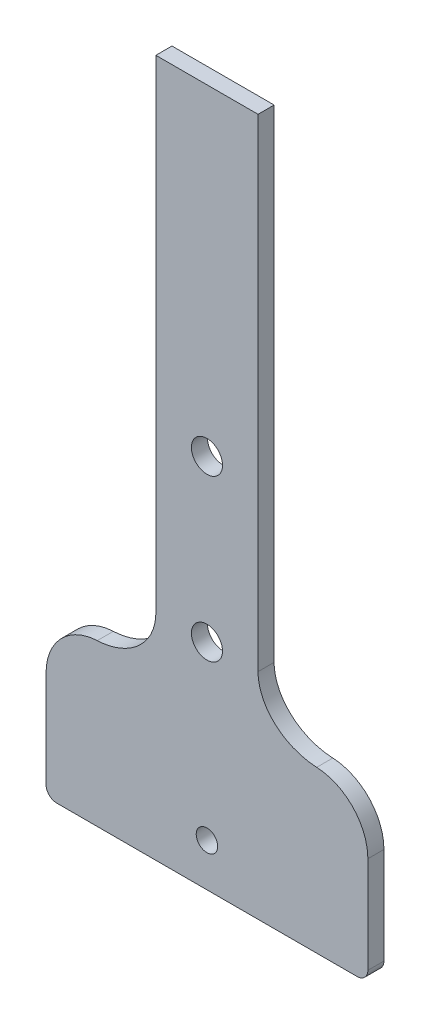
ISO-10303-21;
HEADER;
FILE_DESCRIPTION(('STEP AP214'),'2;1');
FILE_NAME('part.step','',(''),(''),'','','');
FILE_SCHEMA(('AUTOMOTIVE_DESIGN { 1 0 10303 214 1 1 1 1 }'));
ENDSEC;
DATA;
#1=APPLICATION_CONTEXT('core data for automotive mechanical design processes');
#2=APPLICATION_PROTOCOL_DEFINITION('international standard','automotive_design',2000,#1);
#3=PRODUCT_CONTEXT('',#1,'mechanical');
#4=PRODUCT('Part','Part','',(#3));
#5=PRODUCT_RELATED_PRODUCT_CATEGORY('part','',(#4));
#6=PRODUCT_DEFINITION_FORMATION('','',#4);
#7=PRODUCT_DEFINITION_CONTEXT('part definition',#1,'design');
#8=PRODUCT_DEFINITION('design','',#6,#7);
#9=PRODUCT_DEFINITION_SHAPE('','',#8);
#10=(LENGTH_UNIT() NAMED_UNIT(*) SI_UNIT(.MILLI.,.METRE.));
#11=(NAMED_UNIT(*) PLANE_ANGLE_UNIT() SI_UNIT($,.RADIAN.));
#12=(NAMED_UNIT(*) SI_UNIT($,.STERADIAN.) SOLID_ANGLE_UNIT());
#13=UNCERTAINTY_MEASURE_WITH_UNIT(LENGTH_MEASURE(1.E-05),#10,'distance_accuracy_value','');
#14=(GEOMETRIC_REPRESENTATION_CONTEXT(3) GLOBAL_UNCERTAINTY_ASSIGNED_CONTEXT((#13)) GLOBAL_UNIT_ASSIGNED_CONTEXT((#10,
#11,#12)) REPRESENTATION_CONTEXT('',''));
#15=CARTESIAN_POINT('',(0.,0.,0.));
#16=DIRECTION('',(0.,0.,1.));
#17=DIRECTION('',(1.,0.,0.));
#18=AXIS2_PLACEMENT_3D('',#15,#16,#17);
#19=CARTESIAN_POINT('',(1.,1.,1.5));
#20=DIRECTION('',(0.,0.,1.));
#21=DIRECTION('',(1.,0.,0.));
#22=AXIS2_PLACEMENT_3D('',#19,#20,#21);
#23=PLANE('',#22);
#24=CARTESIAN_POINT('',(15.,4.,1.5));
#25=DIRECTION('',(0.,0.,1.));
#26=DIRECTION('',(1.,0.,0.));
#27=AXIS2_PLACEMENT_3D('',#24,#25,#26);
#28=CIRCLE('',#27,1.);
#29=CARTESIAN_POINT('',(16.,4.,1.5));
#30=VERTEX_POINT('',#29);
#31=EDGE_CURVE('E328',#30,#30,#28,.T.);
#32=ORIENTED_EDGE('',*,*,#31,.F.);
#33=EDGE_LOOP('',(#32));
#34=FACE_BOUND('',#33,.T.);
#35=CARTESIAN_POINT('',(1.,1.,1.5));
#36=DIRECTION('',(0.,0.,1.));
#37=DIRECTION('',(1.,0.,0.));
#38=AXIS2_PLACEMENT_3D('',#35,#36,#37);
#39=CIRCLE('',#38,1.);
#40=CARTESIAN_POINT('',(0.,1.,1.5));
#41=VERTEX_POINT('',#40);
#42=CARTESIAN_POINT('',(1.,0.,1.5));
#43=VERTEX_POINT('',#42);
#44=EDGE_CURVE('E321',#41,#43,#39,.T.);
#45=ORIENTED_EDGE('',*,*,#44,.T.);
#46=DIRECTION('',(1.,0.,0.));
#47=VECTOR('',#46,1.);
#48=CARTESIAN_POINT('',(1.,0.,1.5));
#49=LINE('',#48,#47);
#50=CARTESIAN_POINT('',(29.,0.,1.5));
#51=VERTEX_POINT('',#50);
#52=EDGE_CURVE('E108',#43,#51,#49,.T.);
#53=ORIENTED_EDGE('',*,*,#52,.T.);
#54=CARTESIAN_POINT('',(29.,1.,1.5));
#55=DIRECTION('',(0.,0.,1.));
#56=DIRECTION('',(1.,0.,0.));
#57=AXIS2_PLACEMENT_3D('',#54,#55,#56);
#58=CIRCLE('',#57,1.);
#59=CARTESIAN_POINT('',(30.,1.,1.5));
#60=VERTEX_POINT('',#59);
#61=EDGE_CURVE('E225',#51,#60,#58,.T.);
#62=ORIENTED_EDGE('',*,*,#61,.T.);
#63=DIRECTION('',(0.,1.,0.));
#64=VECTOR('',#63,1.);
#65=CARTESIAN_POINT('',(30.,1.,1.5));
#66=LINE('',#65,#64);
#67=CARTESIAN_POINT('',(30.,10.0108052781688,1.5));
#68=VERTEX_POINT('',#67);
#69=EDGE_CURVE('E308',#60,#68,#66,.T.);
#70=ORIENTED_EDGE('',*,*,#69,.T.);
#71=CARTESIAN_POINT('',(25.2299896054474,15.0070576768955,1.5));
#72=CARTESIAN_POINT('',(25.5501568265481,14.9923098332208,1.5));
#73=CARTESIAN_POINT('',(25.8674136613697,14.9468759100156,1.5));
#74=CARTESIAN_POINT('',(26.4886747862802,14.7962083420721,1.5));
#75=CARTESIAN_POINT('',(26.7876262209503,14.6924484106774,1.5));
#76=CARTESIAN_POINT('',(27.3629219554328,14.4299044262166,1.5));
#77=CARTESIAN_POINT('',(27.6420242645875,14.2689345451115,1.5));
#78=CARTESIAN_POINT('',(28.1596792190013,13.9000817217873,1.5));
#79=CARTESIAN_POINT('',(28.398424750681,13.6930933628727,1.5));
#80=CARTESIAN_POINT('',(28.8360631235103,13.2343423824905,1.5));
#81=CARTESIAN_POINT('',(29.0356778101792,12.9804277574317,1.5));
#82=CARTESIAN_POINT('',(29.377858406919,12.4476017200803,1.5));
#83=CARTESIAN_POINT('',(29.5228364402657,12.1667174939612,1.5));
#84=CARTESIAN_POINT('',(29.7596675495884,11.5755076172487,1.5));
#85=CARTESIAN_POINT('',(29.8499485117463,11.2672681189809,1.5));
#86=CARTESIAN_POINT('',(29.9694853442409,10.6466168326974,1.5));
#87=CARTESIAN_POINT('',(30.,10.3313093426447,1.5));
#88=CARTESIAN_POINT('',(30.,10.0108052781688,1.5));
#89=B_SPLINE_CURVE_WITH_KNOTS('',3,(#71,#72,#73,#74,#75,#76,#77,#78,#79,#80,#81,#82,#83,#84,#85,
#86,#87,#88),.UNSPECIFIED.,.F.,.F.,(4,2,2,2,2,2,2,2,4),(0.,0.125,0.25,0.375,0.5,0.625,0.75,
0.875,1.),.UNSPECIFIED.);
#90=CARTESIAN_POINT('',(25.2299896054474,15.0070576768955,1.5));
#91=VERTEX_POINT('',#90);
#92=EDGE_CURVE('E282',#68,#91,#89,.F.);
#93=ORIENTED_EDGE('',*,*,#92,.T.);
#94=CARTESIAN_POINT('',(25.5366424127107,20.,1.5));
#95=DIRECTION('',(0.,0.,-1.));
#96=DIRECTION('',(-1.,0.,0.));
#97=AXIS2_PLACEMENT_3D('',#94,#95,#96);
#98=ELLIPSE('',#97,5.77350269189626,5.);
#99=CARTESIAN_POINT('',(19.7631397208144,20.,1.5));
#100=VERTEX_POINT('',#99);
#101=EDGE_CURVE('E268',#91,#100,#98,.T.);
#102=ORIENTED_EDGE('',*,*,#101,.T.);
#103=DIRECTION('',(0.,1.,0.));
#104=VECTOR('',#103,1.);
#105=CARTESIAN_POINT('',(19.7631397208144,20.,1.5));
#106=LINE('',#105,#104);
#107=CARTESIAN_POINT('',(19.7631397208144,65.,1.5));
#108=VERTEX_POINT('',#107);
#109=EDGE_CURVE('E255',#100,#108,#106,.T.);
#110=ORIENTED_EDGE('',*,*,#109,.T.);
#111=DIRECTION('',(-1.,0.,0.));
#112=VECTOR('',#111,1.);
#113=CARTESIAN_POINT('',(19.7631397208144,65.,1.5));
#114=LINE('',#113,#112);
#115=CARTESIAN_POINT('',(10.2368602791856,65.,1.5));
#116=VERTEX_POINT('',#115);
#117=EDGE_CURVE('E264',#108,#116,#114,.T.);
#118=ORIENTED_EDGE('',*,*,#117,.T.);
#119=DIRECTION('',(0.,-1.,0.));
#120=VECTOR('',#119,1.);
#121=CARTESIAN_POINT('',(10.2368602791856,65.,1.5));
#122=LINE('',#121,#120);
#123=CARTESIAN_POINT('',(10.2368602791856,20.,1.5));
#124=VERTEX_POINT('',#123);
#125=EDGE_CURVE('E140',#116,#124,#122,.T.);
#126=ORIENTED_EDGE('',*,*,#125,.T.);
#127=CARTESIAN_POINT('',(4.46335758728933,20.,1.5));
#128=DIRECTION('',(0.,0.,-1.));
#129=DIRECTION('',(1.,0.,0.));
#130=AXIS2_PLACEMENT_3D('',#127,#128,#129);
#131=ELLIPSE('',#130,5.77350269189626,5.);
#132=CARTESIAN_POINT('',(4.77001039455257,15.0070576768955,1.5));
#133=VERTEX_POINT('',#132);
#134=EDGE_CURVE('E133',#124,#133,#131,.T.);
#135=ORIENTED_EDGE('',*,*,#134,.T.);
#136=CARTESIAN_POINT('',(0.,10.0108052781688,1.5));
#137=CARTESIAN_POINT('',(0.,10.3313070070156,1.5));
#138=CARTESIAN_POINT('',(0.0307509602836312,10.6502705555694,1.5));
#139=CARTESIAN_POINT('',(0.152573660064995,11.2778809843903,1.5));
#140=CARTESIAN_POINT('',(0.242397802366398,11.581322907929,1.5));
#141=CARTESIAN_POINT('',(0.478004618785788,12.1681493861524,1.5));
#142=CARTESIAN_POINT('',(0.625834171278446,12.4543857043808,1.5));
#143=CARTESIAN_POINT('',(0.970282061510011,12.988644640569,1.5));
#144=CARTESIAN_POINT('',(1.16596164994364,13.2367506133586,1.5));
#145=CARTESIAN_POINT('',(1.60386948990164,13.6952096709976,1.5));
#146=CARTESIAN_POINT('',(1.84823792866089,13.9064080334147,1.5));
#147=CARTESIAN_POINT('',(2.36462212455254,14.2729658119091,1.5));
#148=CARTESIAN_POINT('',(2.63847844745342,14.430814604172,1.5));
#149=CARTESIAN_POINT('',(3.21806270084157,14.6947702050187,1.5));
#150=CARTESIAN_POINT('',(3.52181244234221,14.7992208505749,1.5));
#151=CARTESIAN_POINT('',(4.13628201345512,14.9472920664723,1.5));
#152=CARTESIAN_POINT('',(4.44984535708774,14.9923099338054,1.5));
#153=CARTESIAN_POINT('',(4.77001039455257,15.0070576768955,1.5));
#154=B_SPLINE_CURVE_WITH_KNOTS('',3,(#136,#137,#138,#139,#140,#141,#142,#143,#144,#145,#146,
#147,#148,#149,#150,#151,#152,#153),.UNSPECIFIED.,.F.,.F.,(4,2,2,2,2,2,2,2,4),(0.,0.125,0.25,
0.375,0.5,0.625,0.75,0.875,1.),.UNSPECIFIED.);
#155=CARTESIAN_POINT('',(0.,10.0108052781688,1.5));
#156=VERTEX_POINT('',#155);
#157=EDGE_CURVE('E137',#133,#156,#154,.F.);
#158=ORIENTED_EDGE('',*,*,#157,.T.);
#159=DIRECTION('',(0.,-1.,0.));
#160=VECTOR('',#159,1.);
#161=CARTESIAN_POINT('',(0.,10.0108052781688,1.5));
#162=LINE('',#161,#160);
#163=EDGE_CURVE('E52',#156,#41,#162,.T.);
#164=ORIENTED_EDGE('',*,*,#163,.T.);
#165=EDGE_LOOP('',(#45,#53,#62,#70,#93,#102,#110,#118,#126,#135,#158,#164));
#166=FACE_BOUND('',#165,.T.);
#167=CARTESIAN_POINT('',(15.,20.,1.5));
#168=DIRECTION('',(0.,0.,1.));
#169=DIRECTION('',(1.,0.,0.));
#170=AXIS2_PLACEMENT_3D('',#167,#168,#169);
#171=CIRCLE('',#170,1.45);
#172=CARTESIAN_POINT('',(16.45,20.,1.5));
#173=VERTEX_POINT('',#172);
#174=EDGE_CURVE('E190',#173,#173,#171,.T.);
#175=ORIENTED_EDGE('',*,*,#174,.F.);
#176=EDGE_LOOP('',(#175));
#177=FACE_BOUND('',#176,.T.);
#178=CARTESIAN_POINT('',(15.,35.,1.5));
#179=DIRECTION('',(0.,0.,1.));
#180=DIRECTION('',(1.,0.,0.));
#181=AXIS2_PLACEMENT_3D('',#178,#179,#180);
#182=CIRCLE('',#181,1.45);
#183=CARTESIAN_POINT('',(16.45,35.,1.5));
#184=VERTEX_POINT('',#183);
#185=EDGE_CURVE('E334',#184,#184,#182,.T.);
#186=ORIENTED_EDGE('',*,*,#185,.F.);
#187=EDGE_LOOP('',(#186));
#188=FACE_BOUND('',#187,.T.);
#189=ADVANCED_FACE('F33',(#34,#166,#177,#188),#23,.T.);
#190=CARTESIAN_POINT('',(1.,1.,0.));
#191=DIRECTION('',(0.,0.,1.));
#192=DIRECTION('',(1.,0.,0.));
#193=AXIS2_PLACEMENT_3D('',#190,#191,#192);
#194=PLANE('',#193);
#195=CARTESIAN_POINT('',(15.,4.,0.));
#196=DIRECTION('',(0.,0.,1.));
#197=DIRECTION('',(1.,0.,0.));
#198=AXIS2_PLACEMENT_3D('',#195,#196,#197);
#199=CIRCLE('',#198,1.);
#200=CARTESIAN_POINT('',(16.,4.,0.));
#201=VERTEX_POINT('',#200);
#202=EDGE_CURVE('E331',#201,#201,#199,.T.);
#203=ORIENTED_EDGE('',*,*,#202,.T.);
#204=EDGE_LOOP('',(#203));
#205=FACE_BOUND('',#204,.T.);
#206=CARTESIAN_POINT('',(1.,1.,0.));
#207=DIRECTION('',(0.,0.,1.));
#208=DIRECTION('',(1.,0.,0.));
#209=AXIS2_PLACEMENT_3D('',#206,#207,#208);
#210=CIRCLE('',#209,1.);
#211=CARTESIAN_POINT('',(0.,1.,0.));
#212=VERTEX_POINT('',#211);
#213=CARTESIAN_POINT('',(1.,0.,0.));
#214=VERTEX_POINT('',#213);
#215=EDGE_CURVE('E183',#212,#214,#210,.T.);
#216=ORIENTED_EDGE('',*,*,#215,.F.);
#217=DIRECTION('',(0.,-1.,0.));
#218=VECTOR('',#217,1.);
#219=CARTESIAN_POINT('',(0.,10.0108052781688,0.));
#220=LINE('',#219,#218);
#221=CARTESIAN_POINT('',(0.,10.0108052781688,0.));
#222=VERTEX_POINT('',#221);
#223=EDGE_CURVE('E100',#222,#212,#220,.T.);
#224=ORIENTED_EDGE('',*,*,#223,.F.);
#225=CARTESIAN_POINT('',(4.77001039455257,15.0070576768955,0.));
#226=CARTESIAN_POINT('',(4.44984535708774,14.9923099338054,0.));
#227=CARTESIAN_POINT('',(4.13628201345512,14.9472920664723,0.));
#228=CARTESIAN_POINT('',(3.52181244234221,14.7992208505749,0.));
#229=CARTESIAN_POINT('',(3.21806270084157,14.6947702050187,0.));
#230=CARTESIAN_POINT('',(2.63847844745342,14.430814604172,0.));
#231=CARTESIAN_POINT('',(2.36462212455254,14.2729658119091,0.));
#232=CARTESIAN_POINT('',(1.84823792866089,13.9064080334147,0.));
#233=CARTESIAN_POINT('',(1.60386948990164,13.6952096709976,0.));
#234=CARTESIAN_POINT('',(1.16596164994364,13.2367506133586,0.));
#235=CARTESIAN_POINT('',(0.970282061510011,12.988644640569,0.));
#236=CARTESIAN_POINT('',(0.625834171278446,12.4543857043808,0.));
#237=CARTESIAN_POINT('',(0.478004618785788,12.1681493861524,0.));
#238=CARTESIAN_POINT('',(0.242397802366398,11.581322907929,0.));
#239=CARTESIAN_POINT('',(0.152573660064995,11.2778809843903,0.));
#240=CARTESIAN_POINT('',(0.0307509602836312,10.6502705555694,0.));
#241=CARTESIAN_POINT('',(0.,10.3313070070156,0.));
#242=CARTESIAN_POINT('',(0.,10.0108052781688,0.));
#243=B_SPLINE_CURVE_WITH_KNOTS('',3,(#225,#226,#227,#228,#229,#230,#231,#232,#233,#234,#235,
#236,#237,#238,#239,#240,#241,#242),.UNSPECIFIED.,.F.,.F.,(4,2,2,2,2,2,2,2,4),(0.,0.125,0.25,
0.375,0.5,0.625,0.75,0.875,1.),.UNSPECIFIED.);
#244=CARTESIAN_POINT('',(4.77001039455257,15.0070576768955,0.));
#245=VERTEX_POINT('',#244);
#246=EDGE_CURVE('E93',#245,#222,#243,.T.);
#247=ORIENTED_EDGE('',*,*,#246,.F.);
#248=CARTESIAN_POINT('',(4.46335758728933,20.,0.));
#249=DIRECTION('',(0.,0.,-1.));
#250=DIRECTION('',(1.,0.,0.));
#251=AXIS2_PLACEMENT_3D('',#248,#249,#250);
#252=ELLIPSE('',#251,5.77350269189626,5.);
#253=CARTESIAN_POINT('',(10.2368602791856,20.,0.));
#254=VERTEX_POINT('',#253);
#255=EDGE_CURVE('E148',#254,#245,#252,.T.);
#256=ORIENTED_EDGE('',*,*,#255,.F.);
#257=DIRECTION('',(0.,-1.,0.));
#258=VECTOR('',#257,1.);
#259=CARTESIAN_POINT('',(10.2368602791856,65.,0.));
#260=LINE('',#259,#258);
#261=CARTESIAN_POINT('',(10.2368602791856,65.,0.));
#262=VERTEX_POINT('',#261);
#263=EDGE_CURVE('E200',#262,#254,#260,.T.);
#264=ORIENTED_EDGE('',*,*,#263,.F.);
#265=DIRECTION('',(-1.,0.,0.));
#266=VECTOR('',#265,1.);
#267=CARTESIAN_POINT('',(19.7631397208144,65.,0.));
#268=LINE('',#267,#266);
#269=CARTESIAN_POINT('',(19.7631397208144,65.,0.));
#270=VERTEX_POINT('',#269);
#271=EDGE_CURVE('E197',#270,#262,#268,.T.);
#272=ORIENTED_EDGE('',*,*,#271,.F.);
#273=DIRECTION('',(0.,1.,0.));
#274=VECTOR('',#273,1.);
#275=CARTESIAN_POINT('',(19.7631397208144,20.,0.));
#276=LINE('',#275,#274);
#277=CARTESIAN_POINT('',(19.7631397208144,20.,0.));
#278=VERTEX_POINT('',#277);
#279=EDGE_CURVE('E195',#278,#270,#276,.T.);
#280=ORIENTED_EDGE('',*,*,#279,.F.);
#281=CARTESIAN_POINT('',(25.5366424127107,20.,0.));
#282=DIRECTION('',(0.,0.,-1.));
#283=DIRECTION('',(-1.,0.,0.));
#284=AXIS2_PLACEMENT_3D('',#281,#282,#283);
#285=ELLIPSE('',#284,5.77350269189626,5.);
#286=CARTESIAN_POINT('',(25.2299896054474,15.0070576768955,0.));
#287=VERTEX_POINT('',#286);
#288=EDGE_CURVE('E198',#287,#278,#285,.T.);
#289=ORIENTED_EDGE('',*,*,#288,.F.);
#290=CARTESIAN_POINT('',(30.,10.0108052781688,0.));
#291=CARTESIAN_POINT('',(30.,10.3313093426447,0.));
#292=CARTESIAN_POINT('',(29.9694853442409,10.6466168326974,0.));
#293=CARTESIAN_POINT('',(29.8499485117463,11.2672681189809,0.));
#294=CARTESIAN_POINT('',(29.7596675495884,11.5755076172487,0.));
#295=CARTESIAN_POINT('',(29.5228364402657,12.1667174939612,0.));
#296=CARTESIAN_POINT('',(29.377858406919,12.4476017200803,0.));
#297=CARTESIAN_POINT('',(29.0356778101792,12.9804277574317,0.));
#298=CARTESIAN_POINT('',(28.8360631235103,13.2343423824905,0.));
#299=CARTESIAN_POINT('',(28.398424750681,13.6930933628727,0.));
#300=CARTESIAN_POINT('',(28.1596792190013,13.9000817217873,0.));
#301=CARTESIAN_POINT('',(27.6420242645875,14.2689345451115,0.));
#302=CARTESIAN_POINT('',(27.3629219554328,14.4299044262166,0.));
#303=CARTESIAN_POINT('',(26.7876262209503,14.6924484106774,0.));
#304=CARTESIAN_POINT('',(26.4886747862802,14.7962083420721,0.));
#305=CARTESIAN_POINT('',(25.8674136613697,14.9468759100156,0.));
#306=CARTESIAN_POINT('',(25.5501568265481,14.9923098332208,0.));
#307=CARTESIAN_POINT('',(25.2299896054474,15.0070576768955,0.));
#308=B_SPLINE_CURVE_WITH_KNOTS('',3,(#290,#291,#292,#293,#294,#295,#296,#297,#298,#299,#300,
#301,#302,#303,#304,#305,#306,#307),.UNSPECIFIED.,.F.,.F.,(4,2,2,2,2,2,2,2,4),(0.,0.125,0.25,
0.375,0.5,0.625,0.75,0.875,1.),.UNSPECIFIED.);
#309=CARTESIAN_POINT('',(30.,10.0108052781688,0.));
#310=VERTEX_POINT('',#309);
#311=EDGE_CURVE('E233',#310,#287,#308,.T.);
#312=ORIENTED_EDGE('',*,*,#311,.F.);
#313=DIRECTION('',(0.,1.,0.));
#314=VECTOR('',#313,1.);
#315=CARTESIAN_POINT('',(30.,1.,0.));
#316=LINE('',#315,#314);
#317=CARTESIAN_POINT('',(30.,1.,0.));
#318=VERTEX_POINT('',#317);
#319=EDGE_CURVE('E194',#318,#310,#316,.T.);
#320=ORIENTED_EDGE('',*,*,#319,.F.);
#321=CARTESIAN_POINT('',(29.,1.,0.));
#322=DIRECTION('',(0.,0.,1.));
#323=DIRECTION('',(1.,0.,0.));
#324=AXIS2_PLACEMENT_3D('',#321,#322,#323);
#325=CIRCLE('',#324,1.);
#326=CARTESIAN_POINT('',(29.,0.,0.));
#327=VERTEX_POINT('',#326);
#328=EDGE_CURVE('E192',#327,#318,#325,.T.);
#329=ORIENTED_EDGE('',*,*,#328,.F.);
#330=DIRECTION('',(1.,0.,0.));
#331=VECTOR('',#330,1.);
#332=CARTESIAN_POINT('',(1.,0.,0.));
#333=LINE('',#332,#331);
#334=EDGE_CURVE('E189',#214,#327,#333,.T.);
#335=ORIENTED_EDGE('',*,*,#334,.F.);
#336=EDGE_LOOP('',(#216,#224,#247,#256,#264,#272,#280,#289,#312,#320,#329,#335));
#337=FACE_BOUND('',#336,.T.);
#338=CARTESIAN_POINT('',(15.,20.,0.));
#339=DIRECTION('',(0.,0.,1.));
#340=DIRECTION('',(1.,0.,0.));
#341=AXIS2_PLACEMENT_3D('',#338,#339,#340);
#342=CIRCLE('',#341,1.45);
#343=CARTESIAN_POINT('',(16.45,20.,0.));
#344=VERTEX_POINT('',#343);
#345=EDGE_CURVE('E325',#344,#344,#342,.T.);
#346=ORIENTED_EDGE('',*,*,#345,.T.);
#347=EDGE_LOOP('',(#346));
#348=FACE_BOUND('',#347,.T.);
#349=CARTESIAN_POINT('',(15.,35.,0.));
#350=DIRECTION('',(0.,0.,1.));
#351=DIRECTION('',(1.,0.,0.));
#352=AXIS2_PLACEMENT_3D('',#349,#350,#351);
#353=CIRCLE('',#352,1.45);
#354=CARTESIAN_POINT('',(16.45,35.,0.));
#355=VERTEX_POINT('',#354);
#356=EDGE_CURVE('E337',#355,#355,#353,.T.);
#357=ORIENTED_EDGE('',*,*,#356,.T.);
#358=EDGE_LOOP('',(#357));
#359=FACE_BOUND('',#358,.T.);
#360=ADVANCED_FACE('F229',(#205,#337,#348,#359),#194,.F.);
#361=CARTESIAN_POINT('',(1.,1.,1.5));
#362=DIRECTION('',(0.,0.,-1.));
#363=DIRECTION('',(-1.,0.,0.));
#364=AXIS2_PLACEMENT_3D('',#361,#362,#363);
#365=CYLINDRICAL_SURFACE('',#364,1.);
#366=ORIENTED_EDGE('',*,*,#215,.T.);
#367=DIRECTION('',(0.,0.,-1.));
#368=VECTOR('',#367,1.);
#369=CARTESIAN_POINT('',(1.,0.,1.5));
#370=LINE('',#369,#368);
#371=EDGE_CURVE('E11',#43,#214,#370,.T.);
#372=ORIENTED_EDGE('',*,*,#371,.F.);
#373=ORIENTED_EDGE('',*,*,#44,.F.);
#374=DIRECTION('',(0.,0.,-1.));
#375=VECTOR('',#374,1.);
#376=CARTESIAN_POINT('',(0.,1.,1.5));
#377=LINE('',#376,#375);
#378=EDGE_CURVE('E202',#41,#212,#377,.T.);
#379=ORIENTED_EDGE('',*,*,#378,.T.);
#380=EDGE_LOOP('',(#366,#372,#373,#379));
#381=FACE_BOUND('',#380,.T.);
#382=ADVANCED_FACE('F35',(#381),#365,.T.);
#383=CARTESIAN_POINT('',(1.,0.,1.5));
#384=DIRECTION('',(0.,1.,0.));
#385=DIRECTION('',(0.,0.,1.));
#386=AXIS2_PLACEMENT_3D('',#383,#384,#385);
#387=PLANE('',#386);
#388=ORIENTED_EDGE('',*,*,#334,.T.);
#389=DIRECTION('',(0.,0.,-1.));
#390=VECTOR('',#389,1.);
#391=CARTESIAN_POINT('',(29.,0.,1.5));
#392=LINE('',#391,#390);
#393=EDGE_CURVE('E43',#51,#327,#392,.T.);
#394=ORIENTED_EDGE('',*,*,#393,.F.);
#395=ORIENTED_EDGE('',*,*,#52,.F.);
#396=ORIENTED_EDGE('',*,*,#371,.T.);
#397=EDGE_LOOP('',(#388,#394,#395,#396));
#398=FACE_BOUND('',#397,.T.);
#399=ADVANCED_FACE('F400',(#398),#387,.F.);
#400=CARTESIAN_POINT('',(29.,1.,1.5));
#401=DIRECTION('',(0.,0.,-1.));
#402=DIRECTION('',(-1.,0.,0.));
#403=AXIS2_PLACEMENT_3D('',#400,#401,#402);
#404=CYLINDRICAL_SURFACE('',#403,1.);
#405=ORIENTED_EDGE('',*,*,#328,.T.);
#406=DIRECTION('',(0.,0.,-1.));
#407=VECTOR('',#406,1.);
#408=CARTESIAN_POINT('',(30.,1.,1.5));
#409=LINE('',#408,#407);
#410=EDGE_CURVE('E215',#60,#318,#409,.T.);
#411=ORIENTED_EDGE('',*,*,#410,.F.);
#412=ORIENTED_EDGE('',*,*,#61,.F.);
#413=ORIENTED_EDGE('',*,*,#393,.T.);
#414=EDGE_LOOP('',(#405,#411,#412,#413));
#415=FACE_BOUND('',#414,.T.);
#416=ADVANCED_FACE('F223',(#415),#404,.T.);
#417=CARTESIAN_POINT('',(30.,1.,1.5));
#418=DIRECTION('',(-1.,0.,0.));
#419=DIRECTION('',(0.,0.,1.));
#420=AXIS2_PLACEMENT_3D('',#417,#418,#419);
#421=PLANE('',#420);
#422=ORIENTED_EDGE('',*,*,#319,.T.);
#423=DIRECTION('',(0.,0.,-1.));
#424=VECTOR('',#423,1.);
#425=CARTESIAN_POINT('',(30.,10.0108052781688,1.5));
#426=LINE('',#425,#424);
#427=EDGE_CURVE('E218',#68,#310,#426,.T.);
#428=ORIENTED_EDGE('',*,*,#427,.F.);
#429=ORIENTED_EDGE('',*,*,#69,.F.);
#430=ORIENTED_EDGE('',*,*,#410,.T.);
#431=EDGE_LOOP('',(#422,#428,#429,#430));
#432=FACE_BOUND('',#431,.T.);
#433=ADVANCED_FACE('F298',(#432),#421,.F.);
#434=CARTESIAN_POINT('',(30.,10.0108052781688,1.5));
#435=CARTESIAN_POINT('',(30.,10.3313093426447,1.5));
#436=CARTESIAN_POINT('',(29.9694853442409,10.6466168326974,1.5));
#437=CARTESIAN_POINT('',(29.8499485117463,11.2672681189809,1.5));
#438=CARTESIAN_POINT('',(29.7596675495884,11.5755076172487,1.5));
#439=CARTESIAN_POINT('',(29.5228364402657,12.1667174939612,1.5));
#440=CARTESIAN_POINT('',(29.377858406919,12.4476017200803,1.5));
#441=CARTESIAN_POINT('',(29.0356778101792,12.9804277574317,1.5));
#442=CARTESIAN_POINT('',(28.8360631235103,13.2343423824905,1.5));
#443=CARTESIAN_POINT('',(28.398424750681,13.6930933628727,1.5));
#444=CARTESIAN_POINT('',(28.1596792190013,13.9000817217873,1.5));
#445=CARTESIAN_POINT('',(27.6420242645875,14.2689345451115,1.5));
#446=CARTESIAN_POINT('',(27.3629219554328,14.4299044262166,1.5));
#447=CARTESIAN_POINT('',(26.7876262209503,14.6924484106774,1.5));
#448=CARTESIAN_POINT('',(26.4886747862802,14.7962083420721,1.5));
#449=CARTESIAN_POINT('',(25.8674136613697,14.9468759100156,1.5));
#450=CARTESIAN_POINT('',(25.5501568265481,14.9923098332208,1.5));
#451=CARTESIAN_POINT('',(25.2299896054474,15.0070576768955,1.5));
#452=B_SPLINE_CURVE_WITH_KNOTS('',3,(#434,#435,#436,#437,#438,#439,#440,#441,#442,#443,#444,
#445,#446,#447,#448,#449,#450,#451),.UNSPECIFIED.,.F.,.F.,(4,2,2,2,2,2,2,2,4),(0.,0.125,0.25,
0.375,0.5,0.625,0.75,0.875,1.),.UNSPECIFIED.);
#453=DIRECTION('',(0.,0.,-1.));
#454=VECTOR('',#453,1.);
#455=SURFACE_OF_LINEAR_EXTRUSION('',#452,#454);
#456=ORIENTED_EDGE('',*,*,#311,.T.);
#457=DIRECTION('',(0.,0.,-1.));
#458=VECTOR('',#457,1.);
#459=CARTESIAN_POINT('',(25.2299896054474,15.0070576768955,1.5));
#460=LINE('',#459,#458);
#461=EDGE_CURVE('E214',#91,#287,#460,.T.);
#462=ORIENTED_EDGE('',*,*,#461,.F.);
#463=ORIENTED_EDGE('',*,*,#92,.F.);
#464=ORIENTED_EDGE('',*,*,#427,.T.);
#465=EDGE_LOOP('',(#456,#462,#463,#464));
#466=FACE_BOUND('',#465,.T.);
#467=ADVANCED_FACE('F289',(#466),#455,.F.);
#468=DIRECTION('',(0.,0.,-1.));
#469=VECTOR('',#468,1.);
#470=SURFACE_OF_LINEAR_EXTRUSION('',#98,#469);
#471=ORIENTED_EDGE('',*,*,#288,.T.);
#472=DIRECTION('',(0.,0.,-1.));
#473=VECTOR('',#472,1.);
#474=CARTESIAN_POINT('',(19.7631397208144,20.,1.5));
#475=LINE('',#474,#473);
#476=EDGE_CURVE('E211',#100,#278,#475,.T.);
#477=ORIENTED_EDGE('',*,*,#476,.F.);
#478=ORIENTED_EDGE('',*,*,#101,.F.);
#479=ORIENTED_EDGE('',*,*,#461,.T.);
#480=EDGE_LOOP('',(#471,#477,#478,#479));
#481=FACE_BOUND('',#480,.T.);
#482=ADVANCED_FACE('F247',(#481),#470,.F.);
#483=CARTESIAN_POINT('',(19.7631397208144,20.,1.5));
#484=DIRECTION('',(-1.,0.,0.));
#485=DIRECTION('',(0.,0.,1.));
#486=AXIS2_PLACEMENT_3D('',#483,#484,#485);
#487=PLANE('',#486);
#488=ORIENTED_EDGE('',*,*,#279,.T.);
#489=DIRECTION('',(0.,0.,-1.));
#490=VECTOR('',#489,1.);
#491=CARTESIAN_POINT('',(19.7631397208144,65.,1.5));
#492=LINE('',#491,#490);
#493=EDGE_CURVE('E208',#108,#270,#492,.T.);
#494=ORIENTED_EDGE('',*,*,#493,.F.);
#495=ORIENTED_EDGE('',*,*,#109,.F.);
#496=ORIENTED_EDGE('',*,*,#476,.T.);
#497=EDGE_LOOP('',(#488,#494,#495,#496));
#498=FACE_BOUND('',#497,.T.);
#499=ADVANCED_FACE('F253',(#498),#487,.F.);
#500=CARTESIAN_POINT('',(19.7631397208144,65.,1.5));
#501=DIRECTION('',(0.,-1.,0.));
#502=DIRECTION('',(0.,0.,-1.));
#503=AXIS2_PLACEMENT_3D('',#500,#501,#502);
#504=PLANE('',#503);
#505=ORIENTED_EDGE('',*,*,#271,.T.);
#506=DIRECTION('',(0.,0.,-1.));
#507=VECTOR('',#506,1.);
#508=CARTESIAN_POINT('',(10.2368602791856,65.,1.5));
#509=LINE('',#508,#507);
#510=EDGE_CURVE('E205',#116,#262,#509,.T.);
#511=ORIENTED_EDGE('',*,*,#510,.F.);
#512=ORIENTED_EDGE('',*,*,#117,.F.);
#513=ORIENTED_EDGE('',*,*,#493,.T.);
#514=EDGE_LOOP('',(#505,#511,#512,#513));
#515=FACE_BOUND('',#514,.T.);
#516=ADVANCED_FACE('F260',(#515),#504,.F.);
#517=CARTESIAN_POINT('',(10.2368602791856,65.,1.5));
#518=DIRECTION('',(1.,0.,0.));
#519=DIRECTION('',(0.,0.,-1.));
#520=AXIS2_PLACEMENT_3D('',#517,#518,#519);
#521=PLANE('',#520);
#522=ORIENTED_EDGE('',*,*,#263,.T.);
#523=DIRECTION('',(0.,0.,-1.));
#524=VECTOR('',#523,1.);
#525=CARTESIAN_POINT('',(10.2368602791856,20.,1.5));
#526=LINE('',#525,#524);
#527=EDGE_CURVE('E149',#124,#254,#526,.T.);
#528=ORIENTED_EDGE('',*,*,#527,.F.);
#529=ORIENTED_EDGE('',*,*,#125,.F.);
#530=ORIENTED_EDGE('',*,*,#510,.T.);
#531=EDGE_LOOP('',(#522,#528,#529,#530));
#532=FACE_BOUND('',#531,.T.);
#533=ADVANCED_FACE('F263',(#532),#521,.F.);
#534=DIRECTION('',(0.,0.,-1.));
#535=VECTOR('',#534,1.);
#536=SURFACE_OF_LINEAR_EXTRUSION('',#131,#535);
#537=ORIENTED_EDGE('',*,*,#255,.T.);
#538=DIRECTION('',(0.,0.,-1.));
#539=VECTOR('',#538,1.);
#540=CARTESIAN_POINT('',(4.77001039455257,15.0070576768955,1.5));
#541=LINE('',#540,#539);
#542=EDGE_CURVE('E145',#133,#245,#541,.T.);
#543=ORIENTED_EDGE('',*,*,#542,.F.);
#544=ORIENTED_EDGE('',*,*,#134,.F.);
#545=ORIENTED_EDGE('',*,*,#527,.T.);
#546=EDGE_LOOP('',(#537,#543,#544,#545));
#547=FACE_BOUND('',#546,.T.);
#548=ADVANCED_FACE('F146',(#547),#536,.F.);
#549=CARTESIAN_POINT('',(4.77001039455257,15.0070576768955,1.5));
#550=CARTESIAN_POINT('',(4.44984535708774,14.9923099338054,1.5));
#551=CARTESIAN_POINT('',(4.13628201345512,14.9472920664723,1.5));
#552=CARTESIAN_POINT('',(3.52181244234221,14.7992208505749,1.5));
#553=CARTESIAN_POINT('',(3.21806270084157,14.6947702050187,1.5));
#554=CARTESIAN_POINT('',(2.63847844745342,14.430814604172,1.5));
#555=CARTESIAN_POINT('',(2.36462212455254,14.2729658119091,1.5));
#556=CARTESIAN_POINT('',(1.84823792866089,13.9064080334147,1.5));
#557=CARTESIAN_POINT('',(1.60386948990164,13.6952096709976,1.5));
#558=CARTESIAN_POINT('',(1.16596164994364,13.2367506133586,1.5));
#559=CARTESIAN_POINT('',(0.970282061510011,12.988644640569,1.5));
#560=CARTESIAN_POINT('',(0.625834171278446,12.4543857043808,1.5));
#561=CARTESIAN_POINT('',(0.478004618785788,12.1681493861524,1.5));
#562=CARTESIAN_POINT('',(0.242397802366398,11.581322907929,1.5));
#563=CARTESIAN_POINT('',(0.152573660064995,11.2778809843903,1.5));
#564=CARTESIAN_POINT('',(0.0307509602836312,10.6502705555694,1.5));
#565=CARTESIAN_POINT('',(0.,10.3313070070156,1.5));
#566=CARTESIAN_POINT('',(0.,10.0108052781688,1.5));
#567=B_SPLINE_CURVE_WITH_KNOTS('',3,(#549,#550,#551,#552,#553,#554,#555,#556,#557,#558,#559,
#560,#561,#562,#563,#564,#565,#566),.UNSPECIFIED.,.F.,.F.,(4,2,2,2,2,2,2,2,4),(0.,0.125,0.25,
0.375,0.5,0.625,0.75,0.875,1.),.UNSPECIFIED.);
#568=DIRECTION('',(0.,0.,-1.));
#569=VECTOR('',#568,1.);
#570=SURFACE_OF_LINEAR_EXTRUSION('',#567,#569);
#571=ORIENTED_EDGE('',*,*,#246,.T.);
#572=DIRECTION('',(0.,0.,-1.));
#573=VECTOR('',#572,1.);
#574=CARTESIAN_POINT('',(0.,10.0108052781688,1.5));
#575=LINE('',#574,#573);
#576=EDGE_CURVE('E150',#156,#222,#575,.T.);
#577=ORIENTED_EDGE('',*,*,#576,.F.);
#578=ORIENTED_EDGE('',*,*,#157,.F.);
#579=ORIENTED_EDGE('',*,*,#542,.T.);
#580=EDGE_LOOP('',(#571,#577,#578,#579));
#581=FACE_BOUND('',#580,.T.);
#582=ADVANCED_FACE('F153',(#581),#570,.F.);
#583=CARTESIAN_POINT('',(0.,10.0108052781688,1.5));
#584=DIRECTION('',(1.,0.,0.));
#585=DIRECTION('',(0.,0.,-1.));
#586=AXIS2_PLACEMENT_3D('',#583,#584,#585);
#587=PLANE('',#586);
#588=ORIENTED_EDGE('',*,*,#223,.T.);
#589=ORIENTED_EDGE('',*,*,#378,.F.);
#590=ORIENTED_EDGE('',*,*,#163,.F.);
#591=ORIENTED_EDGE('',*,*,#576,.T.);
#592=EDGE_LOOP('',(#588,#589,#590,#591));
#593=FACE_BOUND('',#592,.T.);
#594=ADVANCED_FACE('F173',(#593),#587,.F.);
#595=CARTESIAN_POINT('',(15.,20.,1.5));
#596=DIRECTION('',(0.,0.,-1.));
#597=DIRECTION('',(-1.,0.,0.));
#598=AXIS2_PLACEMENT_3D('',#595,#596,#597);
#599=CYLINDRICAL_SURFACE('',#598,1.45);
#600=ORIENTED_EDGE('',*,*,#174,.T.);
#601=EDGE_LOOP('',(#600));
#602=FACE_BOUND('',#601,.T.);
#603=ORIENTED_EDGE('',*,*,#345,.F.);
#604=EDGE_LOOP('',(#603));
#605=FACE_BOUND('',#604,.T.);
#606=ADVANCED_FACE('F355',(#602,#605),#599,.F.);
#607=CARTESIAN_POINT('',(15.,4.,1.5));
#608=DIRECTION('',(0.,0.,-1.));
#609=DIRECTION('',(-1.,0.,0.));
#610=AXIS2_PLACEMENT_3D('',#607,#608,#609);
#611=CYLINDRICAL_SURFACE('',#610,1.);
#612=ORIENTED_EDGE('',*,*,#31,.T.);
#613=EDGE_LOOP('',(#612));
#614=FACE_BOUND('',#613,.T.);
#615=ORIENTED_EDGE('',*,*,#202,.F.);
#616=EDGE_LOOP('',(#615));
#617=FACE_BOUND('',#616,.T.);
#618=ADVANCED_FACE('F490',(#614,#617),#611,.F.);
#619=CARTESIAN_POINT('',(15.,35.,1.5));
#620=DIRECTION('',(0.,0.,-1.));
#621=DIRECTION('',(-1.,0.,0.));
#622=AXIS2_PLACEMENT_3D('',#619,#620,#621);
#623=CYLINDRICAL_SURFACE('',#622,1.45);
#624=ORIENTED_EDGE('',*,*,#185,.T.);
#625=EDGE_LOOP('',(#624));
#626=FACE_BOUND('',#625,.T.);
#627=ORIENTED_EDGE('',*,*,#356,.F.);
#628=EDGE_LOOP('',(#627));
#629=FACE_BOUND('',#628,.T.);
#630=ADVANCED_FACE('F343',(#626,#629),#623,.F.);
#631=CLOSED_SHELL('',(#189,#360,#382,#399,#416,#433,#467,#482,#499,#516,#533,#548,#582,#594,
#606,#618,#630));
#632=MANIFOLD_SOLID_BREP('B2',#631);
#633=ADVANCED_BREP_SHAPE_REPRESENTATION('',(#18,#632),#14);
#634=SHAPE_DEFINITION_REPRESENTATION(#9,#633);
ENDSEC;
END-ISO-10303-21;
